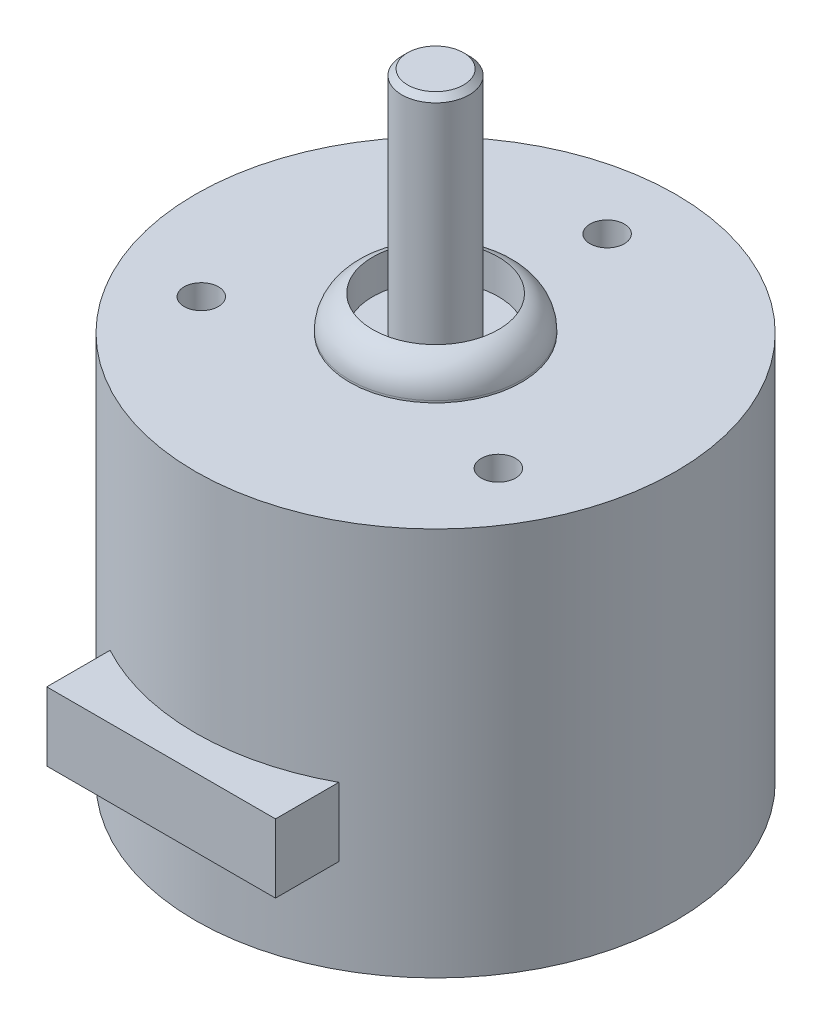
ISO-10303-21;
HEADER;
FILE_DESCRIPTION(('STEP AP214'),'2;1');
FILE_NAME('part.step','',(''),(''),'','','');
FILE_SCHEMA(('AUTOMOTIVE_DESIGN { 1 0 10303 214 1 1 1 1 }'));
ENDSEC;
DATA;
#1=APPLICATION_CONTEXT('core data for automotive mechanical design processes');
#2=APPLICATION_PROTOCOL_DEFINITION('international standard','automotive_design',2000,#1);
#3=PRODUCT_CONTEXT('',#1,'mechanical');
#4=PRODUCT('Part','Part','',(#3));
#5=PRODUCT_RELATED_PRODUCT_CATEGORY('part','',(#4));
#6=PRODUCT_DEFINITION_FORMATION('','',#4);
#7=PRODUCT_DEFINITION_CONTEXT('part definition',#1,'design');
#8=PRODUCT_DEFINITION('design','',#6,#7);
#9=PRODUCT_DEFINITION_SHAPE('','',#8);
#10=(LENGTH_UNIT() NAMED_UNIT(*) SI_UNIT(.MILLI.,.METRE.));
#11=(NAMED_UNIT(*) PLANE_ANGLE_UNIT() SI_UNIT($,.RADIAN.));
#12=(NAMED_UNIT(*) SI_UNIT($,.STERADIAN.) SOLID_ANGLE_UNIT());
#13=UNCERTAINTY_MEASURE_WITH_UNIT(LENGTH_MEASURE(1.E-05),#10,'distance_accuracy_value','');
#14=(GEOMETRIC_REPRESENTATION_CONTEXT(3) GLOBAL_UNCERTAINTY_ASSIGNED_CONTEXT((#13)) GLOBAL_UNIT_ASSIGNED_CONTEXT((#10,
#11,#12)) REPRESENTATION_CONTEXT('',''));
#15=CARTESIAN_POINT('',(0.,0.,0.));
#16=DIRECTION('',(0.,0.,1.));
#17=DIRECTION('',(1.,0.,0.));
#18=AXIS2_PLACEMENT_3D('',#15,#16,#17);
#19=CARTESIAN_POINT('',(0.,17.,0.));
#20=DIRECTION('',(0.,-1.,0.));
#21=DIRECTION('',(0.,0.,-1.));
#22=AXIS2_PLACEMENT_3D('',#19,#20,#21);
#23=CYLINDRICAL_SURFACE('',#22,21.);
#24=DIRECTION('',(0.,-1.,0.));
#25=VECTOR('',#24,1.);
#26=CARTESIAN_POINT('',(-9.99999999999999,-2.8,18.4661853126194));
#27=LINE('',#26,#25);
#28=CARTESIAN_POINT('',(-9.99999999999999,-2.8,18.4661853126194));
#29=VERTEX_POINT('',#28);
#30=CARTESIAN_POINT('',(-9.99999999999999,-8.8,18.4661853126194));
#31=VERTEX_POINT('',#30);
#32=EDGE_CURVE('E68',#29,#31,#27,.T.);
#33=ORIENTED_EDGE('',*,*,#32,.F.);
#34=CARTESIAN_POINT('',(0.,-2.8,0.));
#35=DIRECTION('',(0.,1.,0.));
#36=DIRECTION('',(0.,0.,1.));
#37=AXIS2_PLACEMENT_3D('',#34,#35,#36);
#38=CIRCLE('',#37,21.);
#39=CARTESIAN_POINT('',(10.,-2.8,18.4661853126194));
#40=VERTEX_POINT('',#39);
#41=EDGE_CURVE('E73',#29,#40,#38,.T.);
#42=ORIENTED_EDGE('',*,*,#41,.T.);
#43=DIRECTION('',(0.,-1.,0.));
#44=VECTOR('',#43,1.);
#45=CARTESIAN_POINT('',(10.,-2.8,18.4661853126194));
#46=LINE('',#45,#44);
#47=CARTESIAN_POINT('',(10.,-8.8,18.4661853126194));
#48=VERTEX_POINT('',#47);
#49=EDGE_CURVE('E118',#40,#48,#46,.T.);
#50=ORIENTED_EDGE('',*,*,#49,.T.);
#51=CARTESIAN_POINT('',(0.,-8.8,0.));
#52=DIRECTION('',(0.,1.,0.));
#53=DIRECTION('',(0.,0.,1.));
#54=AXIS2_PLACEMENT_3D('',#51,#52,#53);
#55=CIRCLE('',#54,21.);
#56=EDGE_CURVE('E122',#31,#48,#55,.T.);
#57=ORIENTED_EDGE('',*,*,#56,.F.);
#58=EDGE_LOOP('',(#33,#42,#50,#57));
#59=FACE_BOUND('',#58,.T.);
#60=CARTESIAN_POINT('',(0.,17.,0.));
#61=DIRECTION('',(0.,1.,0.));
#62=DIRECTION('',(0.,0.,1.));
#63=AXIS2_PLACEMENT_3D('',#60,#61,#62);
#64=CIRCLE('',#63,21.);
#65=CARTESIAN_POINT('',(0.,17.,21.));
#66=VERTEX_POINT('',#65);
#67=EDGE_CURVE('E178',#66,#66,#64,.T.);
#68=ORIENTED_EDGE('',*,*,#67,.F.);
#69=EDGE_LOOP('',(#68));
#70=FACE_BOUND('',#69,.T.);
#71=CARTESIAN_POINT('',(0.,-17.,0.));
#72=DIRECTION('',(0.,1.,0.));
#73=DIRECTION('',(0.,0.,1.));
#74=AXIS2_PLACEMENT_3D('',#71,#72,#73);
#75=CIRCLE('',#74,21.);
#76=CARTESIAN_POINT('',(0.,-17.,21.));
#77=VERTEX_POINT('',#76);
#78=EDGE_CURVE('E158',#77,#77,#75,.T.);
#79=ORIENTED_EDGE('',*,*,#78,.T.);
#80=EDGE_LOOP('',(#79));
#81=FACE_BOUND('',#80,.T.);
#82=ADVANCED_FACE('F51',(#59,#70,#81),#23,.T.);
#83=CARTESIAN_POINT('',(0.,17.,0.));
#84=DIRECTION('',(0.,1.,0.));
#85=DIRECTION('',(0.,0.,1.));
#86=AXIS2_PLACEMENT_3D('',#83,#84,#85);
#87=PLANE('',#86);
#88=CARTESIAN_POINT('',(0.,17.,0.));
#89=DIRECTION('',(0.,1.,0.));
#90=DIRECTION('',(0.,0.,1.));
#91=AXIS2_PLACEMENT_3D('',#88,#89,#90);
#92=CIRCLE('',#91,7.5);
#93=CARTESIAN_POINT('',(0.,17.,7.5));
#94=VERTEX_POINT('',#93);
#95=EDGE_CURVE('E149',#94,#94,#92,.T.);
#96=ORIENTED_EDGE('',*,*,#95,.F.);
#97=EDGE_LOOP('',(#96));
#98=FACE_BOUND('',#97,.T.);
#99=CARTESIAN_POINT('',(-12.9903810567666,17.,7.49999999999997));
#100=DIRECTION('',(0.,1.,0.));
#101=DIRECTION('',(0.,0.,1.));
#102=AXIS2_PLACEMENT_3D('',#99,#100,#101);
#103=CIRCLE('',#102,1.5);
#104=CARTESIAN_POINT('',(-12.9903810567666,17.,8.99999999999997));
#105=VERTEX_POINT('',#104);
#106=EDGE_CURVE('E159',#105,#105,#103,.T.);
#107=ORIENTED_EDGE('',*,*,#106,.F.);
#108=EDGE_LOOP('',(#107));
#109=FACE_BOUND('',#108,.T.);
#110=CARTESIAN_POINT('',(12.9903810567666,17.,7.49999999999997));
#111=DIRECTION('',(0.,1.,0.));
#112=DIRECTION('',(0.,0.,1.));
#113=AXIS2_PLACEMENT_3D('',#110,#111,#112);
#114=CIRCLE('',#113,1.5);
#115=CARTESIAN_POINT('',(12.9903810567666,17.,8.99999999999996));
#116=VERTEX_POINT('',#115);
#117=EDGE_CURVE('E167',#116,#116,#114,.T.);
#118=ORIENTED_EDGE('',*,*,#117,.F.);
#119=EDGE_LOOP('',(#118));
#120=FACE_BOUND('',#119,.T.);
#121=CARTESIAN_POINT('',(0.,17.,-15.));
#122=DIRECTION('',(0.,1.,0.));
#123=DIRECTION('',(0.,0.,1.));
#124=AXIS2_PLACEMENT_3D('',#121,#122,#123);
#125=CIRCLE('',#124,1.5);
#126=CARTESIAN_POINT('',(0.,17.,-13.5));
#127=VERTEX_POINT('',#126);
#128=EDGE_CURVE('E153',#127,#127,#125,.T.);
#129=ORIENTED_EDGE('',*,*,#128,.F.);
#130=EDGE_LOOP('',(#129));
#131=FACE_BOUND('',#130,.T.);
#132=ORIENTED_EDGE('',*,*,#67,.T.);
#133=EDGE_LOOP('',(#132));
#134=FACE_BOUND('',#133,.T.);
#135=ADVANCED_FACE('F208',(#98,#109,#120,#131,#134),#87,.T.);
#136=CARTESIAN_POINT('',(0.,-17.,0.));
#137=DIRECTION('',(0.,1.,0.));
#138=DIRECTION('',(0.,0.,1.));
#139=AXIS2_PLACEMENT_3D('',#136,#137,#138);
#140=PLANE('',#139);
#141=ORIENTED_EDGE('',*,*,#78,.F.);
#142=EDGE_LOOP('',(#141));
#143=FACE_BOUND('',#142,.T.);
#144=ADVANCED_FACE('F213',(#143),#140,.F.);
#145=CARTESIAN_POINT('',(0.,7.,-15.));
#146=DIRECTION('',(0.,1.,0.));
#147=DIRECTION('',(0.,0.,1.));
#148=AXIS2_PLACEMENT_3D('',#145,#146,#147);
#149=CYLINDRICAL_SURFACE('',#148,1.5);
#150=CARTESIAN_POINT('',(0.,7.,-15.));
#151=DIRECTION('',(0.,1.,0.));
#152=DIRECTION('',(0.,0.,1.));
#153=AXIS2_PLACEMENT_3D('',#150,#151,#152);
#154=CIRCLE('',#153,1.5);
#155=CARTESIAN_POINT('',(0.,7.,-13.5));
#156=VERTEX_POINT('',#155);
#157=EDGE_CURVE('E171',#156,#156,#154,.T.);
#158=ORIENTED_EDGE('',*,*,#157,.F.);
#159=EDGE_LOOP('',(#158));
#160=FACE_BOUND('',#159,.T.);
#161=ORIENTED_EDGE('',*,*,#128,.T.);
#162=EDGE_LOOP('',(#161));
#163=FACE_BOUND('',#162,.T.);
#164=ADVANCED_FACE('F267',(#160,#163),#149,.F.);
#165=CARTESIAN_POINT('',(0.,7.,-15.));
#166=DIRECTION('',(0.,1.,0.));
#167=DIRECTION('',(0.,0.,1.));
#168=AXIS2_PLACEMENT_3D('',#165,#166,#167);
#169=PLANE('',#168);
#170=ORIENTED_EDGE('',*,*,#157,.T.);
#171=EDGE_LOOP('',(#170));
#172=FACE_BOUND('',#171,.T.);
#173=ADVANCED_FACE('F263',(#172),#169,.T.);
#174=CARTESIAN_POINT('',(12.9903810567666,7.,7.49999999999997));
#175=DIRECTION('',(0.,1.,0.));
#176=DIRECTION('',(0.,0.,1.));
#177=AXIS2_PLACEMENT_3D('',#174,#175,#176);
#178=CYLINDRICAL_SURFACE('',#177,1.5);
#179=CARTESIAN_POINT('',(12.9903810567666,7.,7.49999999999997));
#180=DIRECTION('',(0.,1.,0.));
#181=DIRECTION('',(0.,0.,1.));
#182=AXIS2_PLACEMENT_3D('',#179,#180,#181);
#183=CIRCLE('',#182,1.5);
#184=CARTESIAN_POINT('',(12.9903810567666,7.,8.99999999999996));
#185=VERTEX_POINT('',#184);
#186=EDGE_CURVE('E163',#185,#185,#183,.T.);
#187=ORIENTED_EDGE('',*,*,#186,.F.);
#188=EDGE_LOOP('',(#187));
#189=FACE_BOUND('',#188,.T.);
#190=ORIENTED_EDGE('',*,*,#117,.T.);
#191=EDGE_LOOP('',(#190));
#192=FACE_BOUND('',#191,.T.);
#193=ADVANCED_FACE('F259',(#189,#192),#178,.F.);
#194=CARTESIAN_POINT('',(12.9903810567666,7.,7.49999999999997));
#195=DIRECTION('',(0.,1.,0.));
#196=DIRECTION('',(0.,0.,1.));
#197=AXIS2_PLACEMENT_3D('',#194,#195,#196);
#198=PLANE('',#197);
#199=ORIENTED_EDGE('',*,*,#186,.T.);
#200=EDGE_LOOP('',(#199));
#201=FACE_BOUND('',#200,.T.);
#202=ADVANCED_FACE('F255',(#201),#198,.T.);
#203=CARTESIAN_POINT('',(-12.9903810567666,7.,7.49999999999997));
#204=DIRECTION('',(0.,1.,0.));
#205=DIRECTION('',(0.,0.,1.));
#206=AXIS2_PLACEMENT_3D('',#203,#204,#205);
#207=CYLINDRICAL_SURFACE('',#206,1.5);
#208=CARTESIAN_POINT('',(-12.9903810567666,7.,7.49999999999997));
#209=DIRECTION('',(0.,1.,0.));
#210=DIRECTION('',(0.,0.,1.));
#211=AXIS2_PLACEMENT_3D('',#208,#209,#210);
#212=CIRCLE('',#211,1.5);
#213=CARTESIAN_POINT('',(-12.9903810567666,7.,8.99999999999997));
#214=VERTEX_POINT('',#213);
#215=EDGE_CURVE('E154',#214,#214,#212,.T.);
#216=ORIENTED_EDGE('',*,*,#215,.F.);
#217=EDGE_LOOP('',(#216));
#218=FACE_BOUND('',#217,.T.);
#219=ORIENTED_EDGE('',*,*,#106,.T.);
#220=EDGE_LOOP('',(#219));
#221=FACE_BOUND('',#220,.T.);
#222=ADVANCED_FACE('F251',(#218,#221),#207,.F.);
#223=CARTESIAN_POINT('',(-12.9903810567666,7.,7.49999999999997));
#224=DIRECTION('',(0.,1.,0.));
#225=DIRECTION('',(0.,0.,1.));
#226=AXIS2_PLACEMENT_3D('',#223,#224,#225);
#227=PLANE('',#226);
#228=ORIENTED_EDGE('',*,*,#215,.T.);
#229=EDGE_LOOP('',(#228));
#230=FACE_BOUND('',#229,.T.);
#231=ADVANCED_FACE('F244',(#230),#227,.T.);
#232=CARTESIAN_POINT('',(0.,20.,0.));
#233=DIRECTION('',(0.,-1.,0.));
#234=DIRECTION('',(0.,0.,-1.));
#235=AXIS2_PLACEMENT_3D('',#232,#233,#234);
#236=CYLINDRICAL_SURFACE('',#235,7.5);
#237=CARTESIAN_POINT('',(0.,17.1715728752538,0.));
#238=DIRECTION('',(0.,1.,0.));
#239=DIRECTION('',(0.,0.,1.));
#240=AXIS2_PLACEMENT_3D('',#237,#238,#239);
#241=CIRCLE('',#240,7.5);
#242=CARTESIAN_POINT('',(0.,17.1715728752538,7.5));
#243=VERTEX_POINT('',#242);
#244=EDGE_CURVE('E189',#243,#243,#241,.F.);
#245=ORIENTED_EDGE('',*,*,#244,.T.);
#246=EDGE_LOOP('',(#245));
#247=FACE_BOUND('',#246,.T.);
#248=ORIENTED_EDGE('',*,*,#95,.T.);
#249=EDGE_LOOP('',(#248));
#250=FACE_BOUND('',#249,.T.);
#251=ADVANCED_FACE('F237',(#247,#250),#236,.T.);
#252=CARTESIAN_POINT('',(0.,20.,0.));
#253=DIRECTION('',(0.,-1.,0.));
#254=DIRECTION('',(0.,0.,-1.));
#255=AXIS2_PLACEMENT_3D('',#252,#253,#254);
#256=CYLINDRICAL_SURFACE('',#255,5.5);
#257=CARTESIAN_POINT('',(0.,20.,0.));
#258=DIRECTION('',(0.,1.,0.));
#259=DIRECTION('',(0.,0.,1.));
#260=AXIS2_PLACEMENT_3D('',#257,#258,#259);
#261=CIRCLE('',#260,5.5);
#262=CARTESIAN_POINT('',(0.,20.,5.5));
#263=VERTEX_POINT('',#262);
#264=EDGE_CURVE('E145',#263,#263,#261,.T.);
#265=ORIENTED_EDGE('',*,*,#264,.T.);
#266=EDGE_LOOP('',(#265));
#267=FACE_BOUND('',#266,.T.);
#268=CARTESIAN_POINT('',(0.,17.,0.));
#269=DIRECTION('',(0.,1.,0.));
#270=DIRECTION('',(0.,0.,1.));
#271=AXIS2_PLACEMENT_3D('',#268,#269,#270);
#272=CIRCLE('',#271,5.5);
#273=CARTESIAN_POINT('',(0.,17.,5.5));
#274=VERTEX_POINT('',#273);
#275=EDGE_CURVE('E182',#274,#274,#272,.F.);
#276=ORIENTED_EDGE('',*,*,#275,.T.);
#277=EDGE_LOOP('',(#276));
#278=FACE_BOUND('',#277,.T.);
#279=ADVANCED_FACE('F229',(#267,#278),#256,.F.);
#280=CARTESIAN_POINT('',(0.,17.,0.));
#281=DIRECTION('',(0.,1.,0.));
#282=DIRECTION('',(0.,0.,1.));
#283=AXIS2_PLACEMENT_3D('',#280,#281,#282);
#284=CIRCLE('',#283,2.945);
#285=CARTESIAN_POINT('',(0.,17.,2.945));
#286=VERTEX_POINT('',#285);
#287=EDGE_CURVE('E141',#286,#286,#284,.T.);
#288=ORIENTED_EDGE('',*,*,#287,.F.);
#289=EDGE_LOOP('',(#288));
#290=FACE_BOUND('',#289,.T.);
#291=ORIENTED_EDGE('',*,*,#275,.F.);
#292=EDGE_LOOP('',(#291));
#293=FACE_BOUND('',#292,.T.);
#294=ADVANCED_FACE('F216',(#290,#293),#87,.T.);
#295=CARTESIAN_POINT('',(0.,17.1715728752538,0.));
#296=DIRECTION('',(0.,1.,0.));
#297=DIRECTION('',(0.,0.,1.));
#298=AXIS2_PLACEMENT_3D('',#295,#296,#297);
#299=TOROIDAL_SURFACE('',#298,4.5,3.);
#300=ORIENTED_EDGE('',*,*,#244,.F.);
#301=EDGE_LOOP('',(#300));
#302=FACE_BOUND('',#301,.T.);
#303=ORIENTED_EDGE('',*,*,#264,.F.);
#304=EDGE_LOOP('',(#303));
#305=FACE_BOUND('',#304,.T.);
#306=ADVANCED_FACE('F219',(#302,#305),#299,.T.);
#307=CARTESIAN_POINT('',(0.,37.,0.));
#308=DIRECTION('',(0.,-1.,0.));
#309=DIRECTION('',(0.,0.,-1.));
#310=AXIS2_PLACEMENT_3D('',#307,#308,#309);
#311=CYLINDRICAL_SURFACE('',#310,2.945);
#312=CARTESIAN_POINT('',(0.,36.5,0.));
#313=DIRECTION('',(0.,1.,0.));
#314=DIRECTION('',(0.,0.,1.));
#315=AXIS2_PLACEMENT_3D('',#312,#313,#314);
#316=CIRCLE('',#315,2.945);
#317=CARTESIAN_POINT('',(0.,36.5,2.945));
#318=VERTEX_POINT('',#317);
#319=EDGE_CURVE('E12',#318,#318,#316,.F.);
#320=ORIENTED_EDGE('',*,*,#319,.T.);
#321=EDGE_LOOP('',(#320));
#322=FACE_BOUND('',#321,.T.);
#323=ORIENTED_EDGE('',*,*,#287,.T.);
#324=EDGE_LOOP('',(#323));
#325=FACE_BOUND('',#324,.T.);
#326=ADVANCED_FACE('F221',(#322,#325),#311,.T.);
#327=CARTESIAN_POINT('',(0.,37.,0.));
#328=DIRECTION('',(0.,1.,0.));
#329=DIRECTION('',(0.,0.,1.));
#330=AXIS2_PLACEMENT_3D('',#327,#328,#329);
#331=PLANE('',#330);
#332=CARTESIAN_POINT('',(0.,37.,0.));
#333=DIRECTION('',(0.,1.,0.));
#334=DIRECTION('',(0.,0.,1.));
#335=AXIS2_PLACEMENT_3D('',#332,#333,#334);
#336=CIRCLE('',#335,2.44500000000001);
#337=CARTESIAN_POINT('',(0.,37.,2.44500000000001));
#338=VERTEX_POINT('',#337);
#339=EDGE_CURVE('E61',#338,#338,#336,.T.);
#340=ORIENTED_EDGE('',*,*,#339,.T.);
#341=EDGE_LOOP('',(#340));
#342=FACE_BOUND('',#341,.T.);
#343=ADVANCED_FACE('F196',(#342),#331,.T.);
#344=CARTESIAN_POINT('',(-9.99999999999999,-2.8,0.));
#345=DIRECTION('',(1.,0.,0.));
#346=DIRECTION('',(0.,0.,-1.));
#347=AXIS2_PLACEMENT_3D('',#344,#345,#346);
#348=PLANE('',#347);
#349=DIRECTION('',(0.,0.,1.));
#350=VECTOR('',#349,1.);
#351=CARTESIAN_POINT('',(-9.99999999999999,-8.8,0.));
#352=LINE('',#351,#350);
#353=CARTESIAN_POINT('',(-9.99999999999999,-8.8,24.));
#354=VERTEX_POINT('',#353);
#355=EDGE_CURVE('E105',#31,#354,#352,.T.);
#356=ORIENTED_EDGE('',*,*,#355,.T.);
#357=DIRECTION('',(0.,-1.,0.));
#358=VECTOR('',#357,1.);
#359=CARTESIAN_POINT('',(-9.99999999999999,-2.8,24.));
#360=LINE('',#359,#358);
#361=CARTESIAN_POINT('',(-9.99999999999999,-2.8,24.));
#362=VERTEX_POINT('',#361);
#363=EDGE_CURVE('E102',#362,#354,#360,.T.);
#364=ORIENTED_EDGE('',*,*,#363,.F.);
#365=DIRECTION('',(0.,0.,1.));
#366=VECTOR('',#365,1.);
#367=CARTESIAN_POINT('',(-9.99999999999999,-2.8,0.));
#368=LINE('',#367,#366);
#369=EDGE_CURVE('E91',#29,#362,#368,.T.);
#370=ORIENTED_EDGE('',*,*,#369,.F.);
#371=ORIENTED_EDGE('',*,*,#32,.T.);
#372=EDGE_LOOP('',(#356,#364,#370,#371));
#373=FACE_BOUND('',#372,.T.);
#374=ADVANCED_FACE('F103',(#373),#348,.F.);
#375=CARTESIAN_POINT('',(0.,-2.8,24.));
#376=DIRECTION('',(0.,0.,-1.));
#377=DIRECTION('',(-1.,0.,0.));
#378=AXIS2_PLACEMENT_3D('',#375,#376,#377);
#379=PLANE('',#378);
#380=DIRECTION('',(1.,0.,0.));
#381=VECTOR('',#380,1.);
#382=CARTESIAN_POINT('',(0.,-8.8,24.));
#383=LINE('',#382,#381);
#384=CARTESIAN_POINT('',(10.,-8.8,24.));
#385=VERTEX_POINT('',#384);
#386=EDGE_CURVE('E128',#354,#385,#383,.T.);
#387=ORIENTED_EDGE('',*,*,#386,.T.);
#388=DIRECTION('',(0.,-1.,0.));
#389=VECTOR('',#388,1.);
#390=CARTESIAN_POINT('',(10.,-2.8,24.));
#391=LINE('',#390,#389);
#392=CARTESIAN_POINT('',(10.,-2.8,24.));
#393=VERTEX_POINT('',#392);
#394=EDGE_CURVE('E110',#393,#385,#391,.T.);
#395=ORIENTED_EDGE('',*,*,#394,.F.);
#396=DIRECTION('',(1.,0.,0.));
#397=VECTOR('',#396,1.);
#398=CARTESIAN_POINT('',(0.,-2.8,24.));
#399=LINE('',#398,#397);
#400=EDGE_CURVE('E96',#362,#393,#399,.T.);
#401=ORIENTED_EDGE('',*,*,#400,.F.);
#402=ORIENTED_EDGE('',*,*,#363,.T.);
#403=EDGE_LOOP('',(#387,#395,#401,#402));
#404=FACE_BOUND('',#403,.T.);
#405=ADVANCED_FACE('F112',(#404),#379,.F.);
#406=CARTESIAN_POINT('',(9.99999999999999,-2.8,0.));
#407=DIRECTION('',(1.,0.,0.));
#408=DIRECTION('',(0.,0.,-1.));
#409=AXIS2_PLACEMENT_3D('',#406,#407,#408);
#410=PLANE('',#409);
#411=DIRECTION('',(0.,0.,1.));
#412=VECTOR('',#411,1.);
#413=CARTESIAN_POINT('',(9.99999999999999,-8.8,0.));
#414=LINE('',#413,#412);
#415=EDGE_CURVE('E131',#48,#385,#414,.T.);
#416=ORIENTED_EDGE('',*,*,#415,.F.);
#417=ORIENTED_EDGE('',*,*,#49,.F.);
#418=DIRECTION('',(0.,0.,1.));
#419=VECTOR('',#418,1.);
#420=CARTESIAN_POINT('',(9.99999999999999,-2.8,0.));
#421=LINE('',#420,#419);
#422=EDGE_CURVE('E115',#40,#393,#421,.T.);
#423=ORIENTED_EDGE('',*,*,#422,.T.);
#424=ORIENTED_EDGE('',*,*,#394,.T.);
#425=EDGE_LOOP('',(#416,#417,#423,#424));
#426=FACE_BOUND('',#425,.T.);
#427=ADVANCED_FACE('F344',(#426),#410,.T.);
#428=CARTESIAN_POINT('',(0.,-2.8,0.));
#429=DIRECTION('',(0.,1.,0.));
#430=DIRECTION('',(0.,0.,1.));
#431=AXIS2_PLACEMENT_3D('',#428,#429,#430);
#432=PLANE('',#431);
#433=ORIENTED_EDGE('',*,*,#41,.F.);
#434=ORIENTED_EDGE('',*,*,#369,.T.);
#435=ORIENTED_EDGE('',*,*,#400,.T.);
#436=ORIENTED_EDGE('',*,*,#422,.F.);
#437=EDGE_LOOP('',(#433,#434,#435,#436));
#438=FACE_BOUND('',#437,.T.);
#439=ADVANCED_FACE('F93',(#438),#432,.T.);
#440=CARTESIAN_POINT('',(0.,-8.8,0.));
#441=DIRECTION('',(0.,1.,0.));
#442=DIRECTION('',(0.,0.,1.));
#443=AXIS2_PLACEMENT_3D('',#440,#441,#442);
#444=PLANE('',#443);
#445=ORIENTED_EDGE('',*,*,#56,.T.);
#446=ORIENTED_EDGE('',*,*,#415,.T.);
#447=ORIENTED_EDGE('',*,*,#386,.F.);
#448=ORIENTED_EDGE('',*,*,#355,.F.);
#449=EDGE_LOOP('',(#445,#446,#447,#448));
#450=FACE_BOUND('',#449,.T.);
#451=ADVANCED_FACE('F199',(#450),#444,.F.);
#452=CARTESIAN_POINT('',(0.,37.,0.));
#453=DIRECTION('',(0.,-1.,0.));
#454=DIRECTION('',(0.,0.,-1.));
#455=AXIS2_PLACEMENT_3D('',#452,#453,#454);
#456=CONICAL_SURFACE('',#455,2.44500000000001,0.785398163397452);
#457=ORIENTED_EDGE('',*,*,#319,.F.);
#458=EDGE_LOOP('',(#457));
#459=FACE_BOUND('',#458,.T.);
#460=ORIENTED_EDGE('',*,*,#339,.F.);
#461=EDGE_LOOP('',(#460));
#462=FACE_BOUND('',#461,.T.);
#463=ADVANCED_FACE('F54',(#459,#462),#456,.T.);
#464=CLOSED_SHELL('',(#82,#135,#144,#164,#173,#193,#202,#222,#231,#251,#279,#294,#306,#326,#343,
#374,#405,#427,#439,#451,#463));
#465=MANIFOLD_SOLID_BREP('B2',#464);
#466=ADVANCED_BREP_SHAPE_REPRESENTATION('',(#18,#465),#14);
#467=SHAPE_DEFINITION_REPRESENTATION(#9,#466);
ENDSEC;
END-ISO-10303-21;
